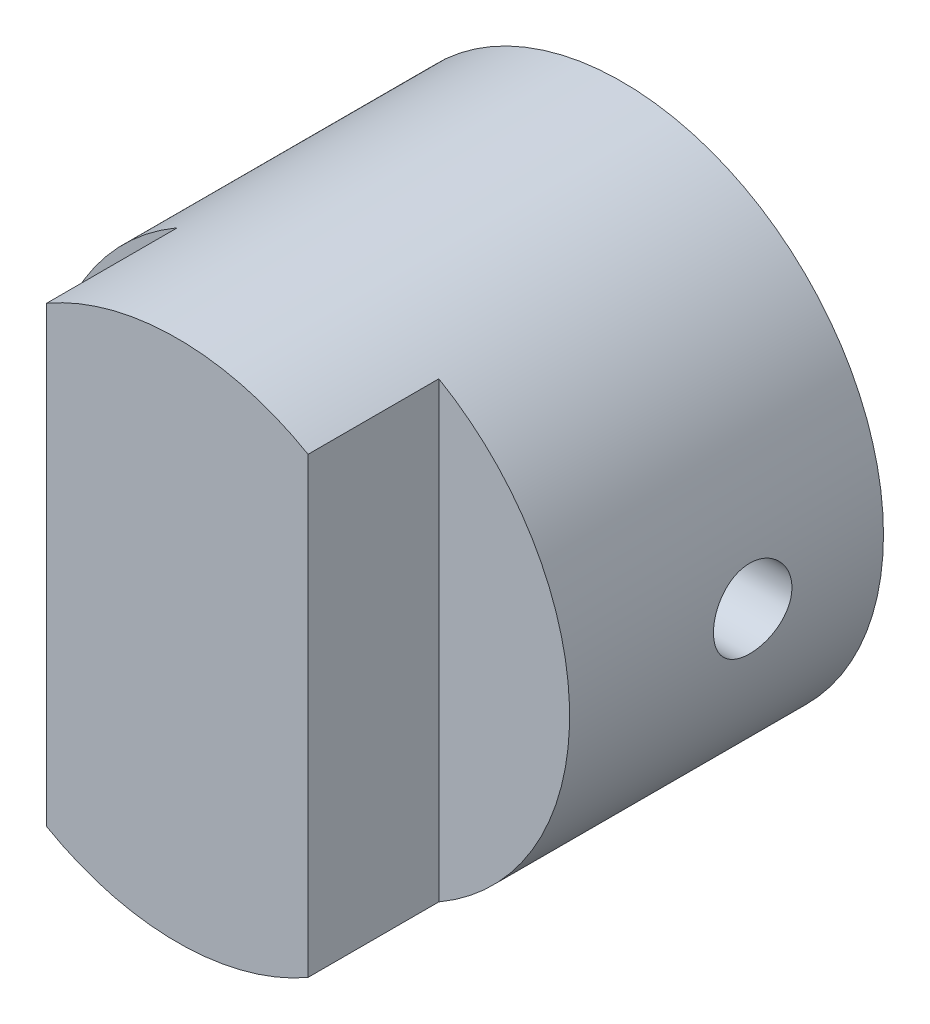
ISO-10303-21;
HEADER;
FILE_DESCRIPTION(('STEP AP214'),'2;1');
FILE_NAME('part.step','',(''),(''),'','','');
FILE_SCHEMA(('AUTOMOTIVE_DESIGN { 1 0 10303 214 1 1 1 1 }'));
ENDSEC;
DATA;
#1=APPLICATION_CONTEXT('core data for automotive mechanical design processes');
#2=APPLICATION_PROTOCOL_DEFINITION('international standard','automotive_design',2000,#1);
#3=PRODUCT_CONTEXT('',#1,'mechanical');
#4=PRODUCT('Part','Part','',(#3));
#5=PRODUCT_RELATED_PRODUCT_CATEGORY('part','',(#4));
#6=PRODUCT_DEFINITION_FORMATION('','',#4);
#7=PRODUCT_DEFINITION_CONTEXT('part definition',#1,'design');
#8=PRODUCT_DEFINITION('design','',#6,#7);
#9=PRODUCT_DEFINITION_SHAPE('','',#8);
#10=(LENGTH_UNIT() NAMED_UNIT(*) SI_UNIT(.MILLI.,.METRE.));
#11=(NAMED_UNIT(*) PLANE_ANGLE_UNIT() SI_UNIT($,.RADIAN.));
#12=(NAMED_UNIT(*) SI_UNIT($,.STERADIAN.) SOLID_ANGLE_UNIT());
#13=UNCERTAINTY_MEASURE_WITH_UNIT(LENGTH_MEASURE(1.E-05),#10,'distance_accuracy_value','');
#14=(GEOMETRIC_REPRESENTATION_CONTEXT(3) GLOBAL_UNCERTAINTY_ASSIGNED_CONTEXT((#13)) GLOBAL_UNIT_ASSIGNED_CONTEXT((#10,
#11,#12)) REPRESENTATION_CONTEXT('',''));
#15=CARTESIAN_POINT('',(0.,0.,0.));
#16=DIRECTION('',(0.,0.,1.));
#17=DIRECTION('',(1.,0.,0.));
#18=AXIS2_PLACEMENT_3D('',#15,#16,#17);
#19=CARTESIAN_POINT('',(0.,0.,17.));
#20=DIRECTION('',(0.,0.,-1.));
#21=DIRECTION('',(-1.,0.,0.));
#22=AXIS2_PLACEMENT_3D('',#19,#20,#21);
#23=CYLINDRICAL_SURFACE('',#22,10.);
#24=CARTESIAN_POINT('',(0.,0.,0.));
#25=DIRECTION('',(0.,0.,1.));
#26=DIRECTION('',(1.,0.,0.));
#27=AXIS2_PLACEMENT_3D('',#24,#25,#26);
#28=CIRCLE('',#27,10.);
#29=CARTESIAN_POINT('',(10.,0.,0.));
#30=VERTEX_POINT('',#29);
#31=EDGE_CURVE('E35',#30,#30,#28,.T.);
#32=ORIENTED_EDGE('',*,*,#31,.T.);
#33=EDGE_LOOP('',(#32));
#34=FACE_BOUND('',#33,.T.);
#35=CARTESIAN_POINT('',(0.,0.,17.));
#36=DIRECTION('',(0.,0.,1.));
#37=DIRECTION('',(1.,0.,0.));
#38=AXIS2_PLACEMENT_3D('',#35,#36,#37);
#39=CIRCLE('',#38,10.);
#40=CARTESIAN_POINT('',(-5.,-8.66025403784439,17.));
#41=VERTEX_POINT('',#40);
#42=CARTESIAN_POINT('',(5.,-8.66025403784439,17.));
#43=VERTEX_POINT('',#42);
#44=EDGE_CURVE('E40',#41,#43,#39,.T.);
#45=ORIENTED_EDGE('',*,*,#44,.F.);
#46=DIRECTION('',(0.,0.,1.));
#47=VECTOR('',#46,1.);
#48=CARTESIAN_POINT('',(-5.,-8.66025403784439,12.));
#49=LINE('',#48,#47);
#50=CARTESIAN_POINT('',(-5.,-8.66025403784439,12.));
#51=VERTEX_POINT('',#50);
#52=EDGE_CURVE('E47',#51,#41,#49,.T.);
#53=ORIENTED_EDGE('',*,*,#52,.F.);
#54=CARTESIAN_POINT('',(0.,0.,12.));
#55=DIRECTION('',(0.,0.,1.));
#56=DIRECTION('',(1.,0.,0.));
#57=AXIS2_PLACEMENT_3D('',#54,#55,#56);
#58=CIRCLE('',#57,10.);
#59=CARTESIAN_POINT('',(-5.,8.66025403784439,12.));
#60=VERTEX_POINT('',#59);
#61=EDGE_CURVE('E76',#60,#51,#58,.T.);
#62=ORIENTED_EDGE('',*,*,#61,.F.);
#63=DIRECTION('',(0.,0.,1.));
#64=VECTOR('',#63,1.);
#65=CARTESIAN_POINT('',(-5.,8.66025403784439,12.));
#66=LINE('',#65,#64);
#67=CARTESIAN_POINT('',(-5.,8.66025403784439,17.));
#68=VERTEX_POINT('',#67);
#69=EDGE_CURVE('E84',#60,#68,#66,.T.);
#70=ORIENTED_EDGE('',*,*,#69,.T.);
#71=CARTESIAN_POINT('',(5.,8.66025403784439,17.));
#72=VERTEX_POINT('',#71);
#73=EDGE_CURVE('E11',#72,#68,#39,.T.);
#74=ORIENTED_EDGE('',*,*,#73,.F.);
#75=DIRECTION('',(0.,0.,1.));
#76=VECTOR('',#75,1.);
#77=CARTESIAN_POINT('',(5.,8.66025403784439,12.));
#78=LINE('',#77,#76);
#79=CARTESIAN_POINT('',(5.,8.66025403784439,12.));
#80=VERTEX_POINT('',#79);
#81=EDGE_CURVE('E55',#80,#72,#78,.T.);
#82=ORIENTED_EDGE('',*,*,#81,.F.);
#83=CARTESIAN_POINT('',(0.,0.,12.));
#84=DIRECTION('',(0.,0.,1.));
#85=DIRECTION('',(1.,0.,0.));
#86=AXIS2_PLACEMENT_3D('',#83,#84,#85);
#87=CIRCLE('',#86,10.);
#88=CARTESIAN_POINT('',(5.,-8.66025403784439,12.));
#89=VERTEX_POINT('',#88);
#90=EDGE_CURVE('E94',#89,#80,#87,.T.);
#91=ORIENTED_EDGE('',*,*,#90,.F.);
#92=DIRECTION('',(0.,0.,1.));
#93=VECTOR('',#92,1.);
#94=CARTESIAN_POINT('',(5.,-8.66025403784439,12.));
#95=LINE('',#94,#93);
#96=EDGE_CURVE('E100',#89,#43,#95,.T.);
#97=ORIENTED_EDGE('',*,*,#96,.T.);
#98=EDGE_LOOP('',(#45,#53,#62,#70,#74,#82,#91,#97));
#99=FACE_BOUND('',#98,.T.);
#100=CARTESIAN_POINT('',(9.88685996664259,-1.5,5.));
#101=CARTESIAN_POINT('',(9.88686136668593,-1.49999654107284,5.08374556928995));
#102=CARTESIAN_POINT('',(9.88793551739101,-1.49296296388491,5.16753975075071));
#103=CARTESIAN_POINT('',(9.8921131480324,-1.46502196657001,5.33278531488313));
#104=CARTESIAN_POINT('',(9.8952186073143,-1.44410101402628,5.41423433148001));
#105=CARTESIAN_POINT('',(9.90309938986228,-1.38902526098084,5.5723737554469));
#106=CARTESIAN_POINT('',(9.90787343131536,-1.35488061681397,5.64906776254216));
#107=CARTESIAN_POINT('',(9.91855194113145,-1.27435063087791,5.79562703077208));
#108=CARTESIAN_POINT('',(9.92445625383668,-1.22796697429872,5.8654932302143));
#109=CARTESIAN_POINT('',(9.9367828924804,-1.12387902418558,5.99698381675433));
#110=CARTESIAN_POINT('',(9.94320862458057,-1.0660960558482,6.05854561340674));
#111=CARTESIAN_POINT('',(9.95582368169047,-0.941019605444373,6.1711374856555));
#112=CARTESIAN_POINT('',(9.96201299368615,-0.873725600786529,6.22216698216699));
#113=CARTESIAN_POINT('',(9.97349347428185,-0.731136358052744,6.31247663169136));
#114=CARTESIAN_POINT('',(9.97878018435569,-0.655804227365766,6.35169915032246));
#115=CARTESIAN_POINT('',(9.98782206746405,-0.499528850106973,6.41691159880818));
#116=CARTESIAN_POINT('',(9.99157732141945,-0.418585900270676,6.44290222784289));
#117=CARTESIAN_POINT('',(9.99710914797782,-0.254031123090568,6.48072338853084));
#118=CARTESIAN_POINT('',(9.99890035887344,-0.170443884389865,6.49265872638717));
#119=CARTESIAN_POINT('',(10.0003524476958,-0.00243520401947755,6.5023559348249));
#120=CARTESIAN_POINT('',(10.0000134440494,0.0819861910157478,6.50011859331969));
#121=CARTESIAN_POINT('',(9.99725499660796,0.248551718200521,6.48161666223757));
#122=CARTESIAN_POINT('',(9.99485227652479,0.330708691400009,6.46546482820852));
#123=CARTESIAN_POINT('',(9.98825500227851,0.491132829143139,6.41976939367743));
#124=CARTESIAN_POINT('',(9.98406040199739,0.569399893513483,6.39022544849856));
#125=CARTESIAN_POINT('',(9.97432193873206,0.720163780770319,6.31846900308291));
#126=CARTESIAN_POINT('',(9.96877303515638,0.792637672323598,6.27620903489126));
#127=CARTESIAN_POINT('',(9.95694438245421,0.92950790715018,6.18025480633002));
#128=CARTESIAN_POINT('',(9.95066458523184,0.993903718271737,6.12655979329314));
#129=CARTESIAN_POINT('',(9.93800158192627,1.11345448272265,6.00863155117341));
#130=CARTESIAN_POINT('',(9.93161796623256,1.16851232950947,5.94429987802989));
#131=CARTESIAN_POINT('',(9.91952704453523,1.26706599338813,5.80725892287627));
#132=CARTESIAN_POINT('',(9.91381974269649,1.31056173927999,5.73454958928008));
#133=CARTESIAN_POINT('',(9.90372775286855,1.38476964534605,5.58271603705936));
#134=CARTESIAN_POINT('',(9.89934409845291,1.41547182270082,5.50358686633761));
#135=CARTESIAN_POINT('',(9.89241402899059,1.46312336208879,5.34121474485261));
#136=CARTESIAN_POINT('',(9.88986748446299,1.48007369337326,5.25797208445325));
#137=CARTESIAN_POINT('',(9.88692451395027,1.49960720086656,5.09059991042251));
#138=CARTESIAN_POINT('',(9.88650748802574,1.50232803265052,5.00648681179847));
#139=CARTESIAN_POINT('',(9.88781607937153,1.49369057019819,4.83900580518266));
#140=CARTESIAN_POINT('',(9.88954163015778,1.48233271282302,4.75563787414924));
#141=CARTESIAN_POINT('',(9.89492202461453,1.44597702952766,4.59244018203437));
#142=CARTESIAN_POINT('',(9.89856716482858,1.42104778527821,4.5125947950584));
#143=CARTESIAN_POINT('',(9.90736801825768,1.35832831947087,4.35821590795139));
#144=CARTESIAN_POINT('',(9.91252380607176,1.32053746276389,4.2836826703718));
#145=CARTESIAN_POINT('',(9.92381355687063,1.23283677995324,4.14142673966496));
#146=CARTESIAN_POINT('',(9.92995459279988,1.18283784561766,4.07375955272018));
#147=CARTESIAN_POINT('',(9.94250159433355,1.07226416837202,3.94772714012619));
#148=CARTESIAN_POINT('',(9.94890757490292,1.0116888274468,3.88936244081885));
#149=CARTESIAN_POINT('',(9.96132705217386,0.881075619628185,3.78309739336642));
#150=CARTESIAN_POINT('',(9.96733683460423,0.810963126771959,3.73528827175752));
#151=CARTESIAN_POINT('',(9.97822905032015,0.663622080263683,3.65212709473736));
#152=CARTESIAN_POINT('',(9.98311151444563,0.586393721360441,3.61677469853497));
#153=CARTESIAN_POINT('',(9.99118269660795,0.427297995861148,3.55967625751197));
#154=CARTESIAN_POINT('',(9.99437761717899,0.345448858754304,3.53788033292164));
#155=CARTESIAN_POINT('',(9.99873976656896,0.179200815501194,3.50835212046253));
#156=CARTESIAN_POINT('',(9.99990712930801,0.0948020781305821,3.50061890375086));
#157=CARTESIAN_POINT('',(10.0000812905914,-0.0732645908608176,3.4994582954506));
#158=CARTESIAN_POINT('',(9.99910917023796,-0.156931570212051,3.50589131912302));
#159=CARTESIAN_POINT('',(9.99515610519141,-0.321979795323106,3.53258138842076));
#160=CARTESIAN_POINT('',(9.99217516692666,-0.403361048396512,3.55283838980856));
#161=CARTESIAN_POINT('',(9.98453786742463,-0.56148937437966,3.60655187557024));
#162=CARTESIAN_POINT('',(9.97988273316947,-0.638239793148782,3.63999869513893));
#163=CARTESIAN_POINT('',(9.96940834495499,-0.785061117896602,3.71912748798314));
#164=CARTESIAN_POINT('',(9.96358905320338,-0.855131806920708,3.76480985848034));
#165=CARTESIAN_POINT('',(9.95136510636178,-0.987312585191958,3.86761769882917));
#166=CARTESIAN_POINT('',(9.94495548425942,-1.04934206644638,3.92484622581634));
#167=CARTESIAN_POINT('',(9.93231001689001,-1.16296808390268,4.04890507308047));
#168=CARTESIAN_POINT('',(9.92607421276291,-1.21456216798984,4.11573764382435));
#169=CARTESIAN_POINT('',(9.91444484029116,-1.30611310822974,4.25754898323254));
#170=CARTESIAN_POINT('',(9.90905620156985,-1.34600294291209,4.33257141702183));
#171=CARTESIAN_POINT('',(9.89978909110724,-1.41255613872045,4.4882967767633));
#172=CARTESIAN_POINT('',(9.89590905307931,-1.43923322574897,4.56899370785782));
#173=CARTESIAN_POINT('',(9.89099485524825,-1.47254951890026,4.70837743625648));
#174=CARTESIAN_POINT('',(9.88945249382379,-1.4828276978042,4.76620339692427));
#175=CARTESIAN_POINT('',(9.88738456567011,-1.49655410576574,4.88267829173435));
#176=CARTESIAN_POINT('',(9.88685898576155,-1.50000242335076,4.94132721519961));
#177=CARTESIAN_POINT('',(9.88685996664259,-1.5,5.));
#178=B_SPLINE_CURVE_WITH_KNOTS('',3,(#100,#101,#102,#103,#104,#105,#106,#107,#108,#109,#110,
#111,#112,#113,#114,#115,#116,#117,#118,#119,#120,#121,#122,#123,#124,#125,#126,#127,#128,#129,
#130,#131,#132,#133,#134,#135,#136,#137,#138,#139,#140,#141,#142,#143,#144,#145,#146,#147,#148,
#149,#150,#151,#152,#153,#154,#155,#156,#157,#158,#159,#160,#161,#162,#163,#164,#165,#166,#167,
#168,#169,#170,#171,#172,#173,#174,#175,#176,#177),.UNSPECIFIED.,.T.,.F.,(4,2,2,2,2,2,2,2,2,2,2,
2,2,2,2,2,2,2,2,2,2,2,2,2,2,2,2,2,2,2,2,2,2,2,2,2,2,2,4),(0.,0.251022251804868,
0.502289469561802,0.753364085335675,1.00440414866133,1.25724158649107,1.51009292207817,
1.76415922105782,2.01821209364501,2.27035832534397,2.52249053939374,2.77259862515728,
3.02271314839401,3.27377316386454,3.52484970949272,3.77839544666269,4.0319427451435,
4.28568751773139,4.53941440444341,4.79068214603744,5.04194209099918,5.29194394807374,
5.54195815286117,5.79385486001302,6.04576581461802,6.29977537753516,6.55377799071854,
6.8068404089109,7.05988611170473,7.31044963622327,7.56101235892823,7.81139182257833,
8.06177941567107,8.31450950010969,8.56729890236862,8.82150878824931,9.07545403445564,
9.25132441891613,9.42719252376192),.UNSPECIFIED.);
#179=CARTESIAN_POINT('',(9.88685996664259,-1.5,5.));
#180=VERTEX_POINT('',#179);
#181=EDGE_CURVE('E155',#180,#180,#178,.T.);
#182=ORIENTED_EDGE('',*,*,#181,.T.);
#183=EDGE_LOOP('',(#182));
#184=FACE_BOUND('',#183,.T.);
#185=ADVANCED_FACE('F32',(#34,#99,#184),#23,.T.);
#186=CARTESIAN_POINT('',(0.,0.,10.));
#187=DIRECTION('',(0.,0.,-1.));
#188=DIRECTION('',(-1.,0.,0.));
#189=AXIS2_PLACEMENT_3D('',#186,#187,#188);
#190=CYLINDRICAL_SURFACE('',#189,7.5);
#191=CARTESIAN_POINT('',(0.,0.,0.));
#192=DIRECTION('',(0.,0.,-1.));
#193=DIRECTION('',(-1.,0.,0.));
#194=AXIS2_PLACEMENT_3D('',#191,#192,#193);
#195=CIRCLE('',#194,7.5);
#196=CARTESIAN_POINT('',(-7.5,0.,0.));
#197=VERTEX_POINT('',#196);
#198=EDGE_CURVE('E102',#197,#197,#195,.T.);
#199=ORIENTED_EDGE('',*,*,#198,.T.);
#200=EDGE_LOOP('',(#199));
#201=FACE_BOUND('',#200,.T.);
#202=CARTESIAN_POINT('',(0.,0.,10.));
#203=DIRECTION('',(0.,0.,-1.));
#204=DIRECTION('',(-1.,0.,0.));
#205=AXIS2_PLACEMENT_3D('',#202,#203,#204);
#206=CIRCLE('',#205,7.5);
#207=CARTESIAN_POINT('',(-7.5,0.,10.));
#208=VERTEX_POINT('',#207);
#209=EDGE_CURVE('E104',#208,#208,#206,.T.);
#210=ORIENTED_EDGE('',*,*,#209,.F.);
#211=EDGE_LOOP('',(#210));
#212=FACE_BOUND('',#211,.T.);
#213=CARTESIAN_POINT('',(7.34846922834953,-1.5,5.));
#214=CARTESIAN_POINT('',(7.34847088538349,-1.49999691881235,4.91665343676424));
#215=CARTESIAN_POINT('',(7.34990262402618,-1.49302975757707,4.83326806500025));
#216=CARTESIAN_POINT('',(7.35546646957747,-1.46536842537441,4.66885624228504));
#217=CARTESIAN_POINT('',(7.35960073717297,-1.44466327060578,4.58783173304596));
#218=CARTESIAN_POINT('',(7.37008310582665,-1.39019367392958,4.43054404496876));
#219=CARTESIAN_POINT('',(7.37642900431582,-1.35644222122892,4.35427621770114));
#220=CARTESIAN_POINT('',(7.39061699221019,-1.27687366150577,4.20848773295455));
#221=CARTESIAN_POINT('',(7.398458998102,-1.23105722790173,4.13896669919314));
#222=CARTESIAN_POINT('',(7.4148794954137,-1.12796861348015,4.00765849421922));
#223=CARTESIAN_POINT('',(7.42346606755867,-1.07055848386998,3.94598061817404));
#224=CARTESIAN_POINT('',(7.440337084539,-0.946210183531967,3.83306369963153));
#225=CARTESIAN_POINT('',(7.44862150816248,-0.879271345466977,3.78182538887421));
#226=CARTESIAN_POINT('',(7.46404194626342,-0.737042033886384,3.69081797355731));
#227=CARTESIAN_POINT('',(7.47116732162326,-0.661683851508316,3.65115272927504));
#228=CARTESIAN_POINT('',(7.48337605325447,-0.505206225580908,3.5850875944278));
#229=CARTESIAN_POINT('',(7.48845960066179,-0.42408732213083,3.55868646214852));
#230=CARTESIAN_POINT('',(7.49595481032628,-0.259525159917742,3.52023920957056));
#231=CARTESIAN_POINT('',(7.4984007943219,-0.176126608822221,3.50800853364349));
#232=CARTESIAN_POINT('',(7.50046381775405,-0.00842785265630479,3.49767357224253));
#233=CARTESIAN_POINT('',(7.50008112979138,0.0758722647477644,3.49956792553127));
#234=CARTESIAN_POINT('',(7.49655652302773,0.241713001115383,3.51728927032333));
#235=CARTESIAN_POINT('',(7.49345397548757,0.323275821447705,3.53291746575177));
#236=CARTESIAN_POINT('',(7.48488265739113,0.482597439870452,3.57734754868834));
#237=CARTESIAN_POINT('',(7.47941379216059,0.560356085620694,3.60614996328781));
#238=CARTESIAN_POINT('',(7.46665944029938,0.710429194801331,3.6762950602209));
#239=CARTESIAN_POINT('',(7.45936272262835,0.78270626120085,3.71771562665733));
#240=CARTESIAN_POINT('',(7.44375704210678,0.919357568789634,3.8118636158549));
#241=CARTESIAN_POINT('',(7.43544796282833,0.983730899287501,3.86459233965577));
#242=CARTESIAN_POINT('',(7.41856446546689,1.10392714658019,3.98095043316271));
#243=CARTESIAN_POINT('',(7.40998794686274,1.15958147486045,4.04475378009438));
#244=CARTESIAN_POINT('',(7.39367357398141,1.25942773976521,4.18087466367613));
#245=CARTESIAN_POINT('',(7.38593573556822,1.30361945959163,4.25319236132479));
#246=CARTESIAN_POINT('',(7.37217071209386,1.37934422220282,4.40453124773271));
#247=CARTESIAN_POINT('',(7.36614722345324,1.41084997166656,4.48356645145949));
#248=CARTESIAN_POINT('',(7.35654714481909,1.46008551244137,4.64595698558599));
#249=CARTESIAN_POINT('',(7.35297023592642,1.47781709918496,4.72931175142863));
#250=CARTESIAN_POINT('',(7.34873218901741,1.49874900905408,4.89644728699857));
#251=CARTESIAN_POINT('',(7.34802220585731,1.50219278834687,4.98019636146551));
#252=CARTESIAN_POINT('',(7.34946728533281,1.49510644246611,5.14707233479953));
#253=CARTESIAN_POINT('',(7.35162218550582,1.48457710968366,5.2301992686783));
#254=CARTESIAN_POINT('',(7.35850848742372,1.45005331211124,5.39265296043835));
#255=CARTESIAN_POINT('',(7.36321498521745,1.42618893125895,5.47200851455365));
#256=CARTESIAN_POINT('',(7.37465234027497,1.36581155296278,5.62559491854311));
#257=CARTESIAN_POINT('',(7.38138336429404,1.32929751355977,5.69982534565358));
#258=CARTESIAN_POINT('',(7.39622108943059,1.2441062133234,5.84211966492524));
#259=CARTESIAN_POINT('',(7.40434457797355,1.19527661697413,5.91009056945124));
#260=CARTESIAN_POINT('',(7.42100585739955,1.08704335831907,6.03696246800137));
#261=CARTESIAN_POINT('',(7.42954369085727,1.02763860771681,6.09586252737388));
#262=CARTESIAN_POINT('',(7.44623018803823,0.898848410246837,6.20384383877837));
#263=CARTESIAN_POINT('',(7.45437086563026,0.829323748394445,6.252760481975));
#264=CARTESIAN_POINT('',(7.4692069144293,0.682901844952134,6.33821882224938));
#265=CARTESIAN_POINT('',(7.47590234632816,0.606004913150261,6.37476103901717));
#266=CARTESIAN_POINT('',(7.487059410916,0.44745402123602,6.43419330761995));
#267=CARTESIAN_POINT('',(7.49153368713906,0.365830010217118,6.45716077733938));
#268=CARTESIAN_POINT('',(7.4977985390649,0.19978418201987,6.48903687149577));
#269=CARTESIAN_POINT('',(7.49958943799765,0.115362703066822,6.49794718921353));
#270=CARTESIAN_POINT('',(7.50027810681181,-0.052309340855434,6.50139047144433));
#271=CARTESIAN_POINT('',(7.49922567824026,-0.135554718212252,6.49617092068432));
#272=CARTESIAN_POINT('',(7.49445065340477,-0.299956546973461,6.47204907417828));
#273=CARTESIAN_POINT('',(7.49072809071528,-0.381113024630535,6.45314695047789));
#274=CARTESIAN_POINT('',(7.481032475475,-0.538879124617643,6.40230651186253));
#275=CARTESIAN_POINT('',(7.47506455871866,-0.61549866486042,6.37039793280323));
#276=CARTESIAN_POINT('',(7.46152083185077,-0.762331830278928,6.29448163800365));
#277=CARTESIAN_POINT('',(7.45394489468828,-0.832544948651117,6.25047296614443));
#278=CARTESIAN_POINT('',(7.43786398736791,-0.965795835159534,6.15077091940688));
#279=CARTESIAN_POINT('',(7.4293460013317,-1.02869957417475,6.09490049541984));
#280=CARTESIAN_POINT('',(7.41241834355477,-1.14432392663527,5.97342463985635));
#281=CARTESIAN_POINT('',(7.40400869794476,-1.19704212480408,5.90781690579693));
#282=CARTESIAN_POINT('',(7.3881501412478,-1.29133832918279,5.7678810249497));
#283=CARTESIAN_POINT('',(7.38071255446371,-1.33279022195961,5.69346655825931));
#284=CARTESIAN_POINT('',(7.36777855777287,-1.40253607393175,5.5386008400506));
#285=CARTESIAN_POINT('',(7.36228038807748,-1.43084196896908,5.45815514195366));
#286=CARTESIAN_POINT('',(7.3549452169166,-1.4680037097813,5.31460631684475));
#287=CARTESIAN_POINT('',(7.35253177367824,-1.47998084778413,5.25232187073152));
#288=CARTESIAN_POINT('',(7.34929317692711,-1.49598002694097,5.12669906817085));
#289=CARTESIAN_POINT('',(7.34846796865858,-1.50000234234439,5.06336074813256));
#290=CARTESIAN_POINT('',(7.34846922834953,-1.5,5.));
#291=B_SPLINE_CURVE_WITH_KNOTS('',3,(#213,#214,#215,#216,#217,#218,#219,#220,#221,#222,#223,
#224,#225,#226,#227,#228,#229,#230,#231,#232,#233,#234,#235,#236,#237,#238,#239,#240,#241,#242,
#243,#244,#245,#246,#247,#248,#249,#250,#251,#252,#253,#254,#255,#256,#257,#258,#259,#260,#261,
#262,#263,#264,#265,#266,#267,#268,#269,#270,#271,#272,#273,#274,#275,#276,#277,#278,#279,#280,
#281,#282,#283,#284,#285,#286,#287,#288,#289,#290),.UNSPECIFIED.,.T.,.F.,(4,2,2,2,2,2,2,2,2,2,2,
2,2,2,2,2,2,2,2,2,2,2,2,2,2,2,2,2,2,2,2,2,2,2,2,2,2,2,4),(0.,0.249807695804143,
0.499815358926445,0.749574746910878,0.999320197289795,1.25223378822655,1.50516510053133,
1.76030100656175,2.0154130236984,2.26716373324621,2.51889018174372,2.76703184450306,
3.01518343610625,3.26489886333455,3.51464303655099,3.76874020143725,4.0228421718408,
4.27748794759165,4.53210052524037,4.78235636706891,5.03259801792632,5.28044012674978,
5.52830265531598,5.77939589661782,6.03051499305313,6.28548902600176,6.54045234945157,
6.79394720367975,7.04741152037442,7.29646526122029,7.54551587050135,7.79400025613178,
8.04250428202026,8.29501728038395,8.54759008334672,8.80288347868562,9.05794462633399,
9.24785705455344,9.43776293526322),.UNSPECIFIED.);
#292=CARTESIAN_POINT('',(7.34846922834953,-1.5,5.));
#293=VERTEX_POINT('',#292);
#294=EDGE_CURVE('E153',#293,#293,#291,.T.);
#295=ORIENTED_EDGE('',*,*,#294,.T.);
#296=EDGE_LOOP('',(#295));
#297=FACE_BOUND('',#296,.T.);
#298=ADVANCED_FACE('F110',(#201,#212,#297),#190,.F.);
#299=CARTESIAN_POINT('',(0.,0.,17.));
#300=DIRECTION('',(0.,0.,1.));
#301=DIRECTION('',(1.,0.,0.));
#302=AXIS2_PLACEMENT_3D('',#299,#300,#301);
#303=PLANE('',#302);
#304=DIRECTION('',(0.,1.,0.));
#305=VECTOR('',#304,1.);
#306=CARTESIAN_POINT('',(-5.,8.66025403784439,17.));
#307=LINE('',#306,#305);
#308=EDGE_CURVE('E81',#41,#68,#307,.T.);
#309=ORIENTED_EDGE('',*,*,#308,.F.);
#310=ORIENTED_EDGE('',*,*,#44,.T.);
#311=DIRECTION('',(0.,-1.,0.));
#312=VECTOR('',#311,1.);
#313=CARTESIAN_POINT('',(5.,8.66025403784439,17.));
#314=LINE('',#313,#312);
#315=EDGE_CURVE('E90',#72,#43,#314,.T.);
#316=ORIENTED_EDGE('',*,*,#315,.F.);
#317=ORIENTED_EDGE('',*,*,#73,.T.);
#318=EDGE_LOOP('',(#309,#310,#316,#317));
#319=FACE_BOUND('',#318,.T.);
#320=ADVANCED_FACE('F117',(#319),#303,.T.);
#321=CARTESIAN_POINT('',(0.,0.,0.));
#322=DIRECTION('',(0.,0.,1.));
#323=DIRECTION('',(1.,0.,0.));
#324=AXIS2_PLACEMENT_3D('',#321,#322,#323);
#325=PLANE('',#324);
#326=ORIENTED_EDGE('',*,*,#198,.F.);
#327=EDGE_LOOP('',(#326));
#328=FACE_BOUND('',#327,.T.);
#329=ORIENTED_EDGE('',*,*,#31,.F.);
#330=EDGE_LOOP('',(#329));
#331=FACE_BOUND('',#330,.T.);
#332=ADVANCED_FACE('F113',(#328,#331),#325,.F.);
#333=CARTESIAN_POINT('',(0.,0.,10.));
#334=DIRECTION('',(0.,0.,-1.));
#335=DIRECTION('',(-1.,0.,0.));
#336=AXIS2_PLACEMENT_3D('',#333,#334,#335);
#337=PLANE('',#336);
#338=ORIENTED_EDGE('',*,*,#209,.T.);
#339=EDGE_LOOP('',(#338));
#340=FACE_BOUND('',#339,.T.);
#341=ADVANCED_FACE('F116',(#340),#337,.T.);
#342=CARTESIAN_POINT('',(5.,8.66025403784439,12.));
#343=DIRECTION('',(-1.,0.,0.));
#344=DIRECTION('',(0.,0.,1.));
#345=AXIS2_PLACEMENT_3D('',#342,#343,#344);
#346=PLANE('',#345);
#347=ORIENTED_EDGE('',*,*,#315,.T.);
#348=ORIENTED_EDGE('',*,*,#96,.F.);
#349=DIRECTION('',(0.,-1.,0.));
#350=VECTOR('',#349,1.);
#351=CARTESIAN_POINT('',(5.,8.66025403784439,12.));
#352=LINE('',#351,#350);
#353=EDGE_CURVE('E96',#80,#89,#352,.T.);
#354=ORIENTED_EDGE('',*,*,#353,.F.);
#355=ORIENTED_EDGE('',*,*,#81,.T.);
#356=EDGE_LOOP('',(#347,#348,#354,#355));
#357=FACE_BOUND('',#356,.T.);
#358=ADVANCED_FACE('F123',(#357),#346,.F.);
#359=CARTESIAN_POINT('',(0.,0.,12.));
#360=DIRECTION('',(0.,0.,1.));
#361=DIRECTION('',(1.,0.,0.));
#362=AXIS2_PLACEMENT_3D('',#359,#360,#361);
#363=PLANE('',#362);
#364=ORIENTED_EDGE('',*,*,#90,.T.);
#365=ORIENTED_EDGE('',*,*,#353,.T.);
#366=EDGE_LOOP('',(#364,#365));
#367=FACE_BOUND('',#366,.T.);
#368=ADVANCED_FACE('F126',(#367),#363,.T.);
#369=CARTESIAN_POINT('',(-5.,8.66025403784439,12.));
#370=DIRECTION('',(1.,0.,0.));
#371=DIRECTION('',(0.,0.,-1.));
#372=AXIS2_PLACEMENT_3D('',#369,#370,#371);
#373=PLANE('',#372);
#374=ORIENTED_EDGE('',*,*,#308,.T.);
#375=ORIENTED_EDGE('',*,*,#69,.F.);
#376=DIRECTION('',(0.,1.,0.));
#377=VECTOR('',#376,1.);
#378=CARTESIAN_POINT('',(-5.,8.66025403784439,12.));
#379=LINE('',#378,#377);
#380=EDGE_CURVE('E78',#51,#60,#379,.T.);
#381=ORIENTED_EDGE('',*,*,#380,.F.);
#382=ORIENTED_EDGE('',*,*,#52,.T.);
#383=EDGE_LOOP('',(#374,#375,#381,#382));
#384=FACE_BOUND('',#383,.T.);
#385=ADVANCED_FACE('F83',(#384),#373,.F.);
#386=CARTESIAN_POINT('',(0.,0.,12.));
#387=DIRECTION('',(0.,0.,1.));
#388=DIRECTION('',(1.,0.,0.));
#389=AXIS2_PLACEMENT_3D('',#386,#387,#388);
#390=PLANE('',#389);
#391=ORIENTED_EDGE('',*,*,#61,.T.);
#392=ORIENTED_EDGE('',*,*,#380,.T.);
#393=EDGE_LOOP('',(#391,#392));
#394=FACE_BOUND('',#393,.T.);
#395=ADVANCED_FACE('F77',(#394),#390,.T.);
#396=CARTESIAN_POINT('',(10.001,0.,5.));
#397=DIRECTION('',(-1.,0.,0.));
#398=DIRECTION('',(0.,-1.,0.));
#399=AXIS2_PLACEMENT_3D('',#396,#397,#398);
#400=CYLINDRICAL_SURFACE('',#399,1.5);
#401=ORIENTED_EDGE('',*,*,#294,.F.);
#402=EDGE_LOOP('',(#401));
#403=FACE_BOUND('',#402,.T.);
#404=ORIENTED_EDGE('',*,*,#181,.F.);
#405=EDGE_LOOP('',(#404));
#406=FACE_BOUND('',#405,.T.);
#407=ADVANCED_FACE('F166',(#403,#406),#400,.F.);
#408=CLOSED_SHELL('',(#185,#298,#320,#332,#341,#358,#368,#385,#395,#407));
#409=MANIFOLD_SOLID_BREP('B2',#408);
#410=ADVANCED_BREP_SHAPE_REPRESENTATION('',(#18,#409),#14);
#411=SHAPE_DEFINITION_REPRESENTATION(#9,#410);
ENDSEC;
END-ISO-10303-21;
